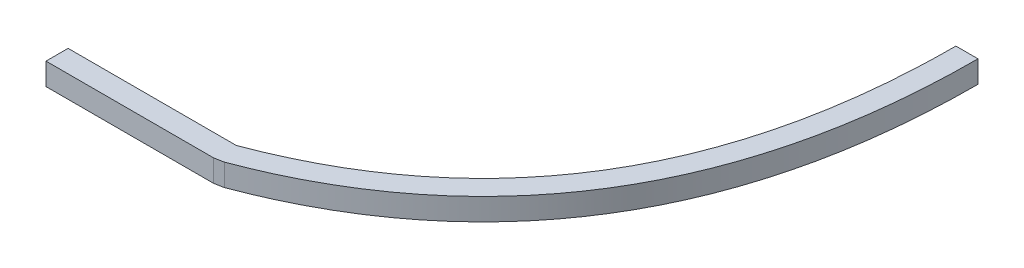
ISO-10303-21;
HEADER;
FILE_DESCRIPTION(('STEP AP214'),'2;1');
FILE_NAME('part.step','',(''),(''),'','','');
FILE_SCHEMA(('AUTOMOTIVE_DESIGN { 1 0 10303 214 1 1 1 1 }'));
ENDSEC;
DATA;
#1=APPLICATION_CONTEXT('core data for automotive mechanical design processes');
#2=APPLICATION_PROTOCOL_DEFINITION('international standard','automotive_design',2000,#1);
#3=PRODUCT_CONTEXT('',#1,'mechanical');
#4=PRODUCT('Part','Part','',(#3));
#5=PRODUCT_RELATED_PRODUCT_CATEGORY('part','',(#4));
#6=PRODUCT_DEFINITION_FORMATION('','',#4);
#7=PRODUCT_DEFINITION_CONTEXT('part definition',#1,'design');
#8=PRODUCT_DEFINITION('design','',#6,#7);
#9=PRODUCT_DEFINITION_SHAPE('','',#8);
#10=(LENGTH_UNIT() NAMED_UNIT(*) SI_UNIT(.MILLI.,.METRE.));
#11=(NAMED_UNIT(*) PLANE_ANGLE_UNIT() SI_UNIT($,.RADIAN.));
#12=(NAMED_UNIT(*) SI_UNIT($,.STERADIAN.) SOLID_ANGLE_UNIT());
#13=UNCERTAINTY_MEASURE_WITH_UNIT(LENGTH_MEASURE(1.E-05),#10,'distance_accuracy_value','');
#14=(GEOMETRIC_REPRESENTATION_CONTEXT(3) GLOBAL_UNCERTAINTY_ASSIGNED_CONTEXT((#13)) GLOBAL_UNIT_ASSIGNED_CONTEXT((#10,
#11,#12)) REPRESENTATION_CONTEXT('',''));
#15=CARTESIAN_POINT('',(0.,0.,0.));
#16=DIRECTION('',(0.,0.,1.));
#17=DIRECTION('',(1.,0.,0.));
#18=AXIS2_PLACEMENT_3D('',#15,#16,#17);
#19=CARTESIAN_POINT('',(-99.9999999999999,0.,0.));
#20=DIRECTION('',(1.,0.,0.));
#21=DIRECTION('',(0.,0.,-1.));
#22=AXIS2_PLACEMENT_3D('',#19,#20,#21);
#23=PLANE('',#22);
#24=DIRECTION('',(0.,0.,-1.));
#25=VECTOR('',#24,1.);
#26=CARTESIAN_POINT('',(-99.9999999999999,5.,0.));
#27=LINE('',#26,#25);
#28=CARTESIAN_POINT('',(-99.9999999999999,5.,5.));
#29=VERTEX_POINT('',#28);
#30=CARTESIAN_POINT('',(-99.9999999999999,5.,0.));
#31=VERTEX_POINT('',#30);
#32=EDGE_CURVE('E11',#29,#31,#27,.T.);
#33=ORIENTED_EDGE('',*,*,#32,.T.);
#34=DIRECTION('',(0.,1.,0.));
#35=VECTOR('',#34,1.);
#36=CARTESIAN_POINT('',(-99.9999999999999,5.,0.));
#37=LINE('',#36,#35);
#38=CARTESIAN_POINT('',(-99.9999999999999,0.,0.));
#39=VERTEX_POINT('',#38);
#40=EDGE_CURVE('E54',#39,#31,#37,.T.);
#41=ORIENTED_EDGE('',*,*,#40,.F.);
#42=DIRECTION('',(0.,0.,-1.));
#43=VECTOR('',#42,1.);
#44=CARTESIAN_POINT('',(-99.9999999999999,0.,0.));
#45=LINE('',#44,#43);
#46=CARTESIAN_POINT('',(-99.9999999999999,0.,5.));
#47=VERTEX_POINT('',#46);
#48=EDGE_CURVE('E108',#47,#39,#45,.T.);
#49=ORIENTED_EDGE('',*,*,#48,.F.);
#50=DIRECTION('',(0.,1.,0.));
#51=VECTOR('',#50,1.);
#52=CARTESIAN_POINT('',(-99.9999999999999,5.,5.));
#53=LINE('',#52,#51);
#54=EDGE_CURVE('E41',#47,#29,#53,.T.);
#55=ORIENTED_EDGE('',*,*,#54,.T.);
#56=EDGE_LOOP('',(#33,#41,#49,#55));
#57=FACE_BOUND('',#56,.T.);
#58=ADVANCED_FACE('F34',(#57),#23,.F.);
#59=CARTESIAN_POINT('',(-1.09929091052435,5.,-6.06425803318716));
#60=DIRECTION('',(0.178366872660046,0.,0.983964053579944));
#61=DIRECTION('',(0.983964053579944,0.,-0.178366872660046));
#62=AXIS2_PLACEMENT_3D('',#59,#60,#61);
#63=PLANE('',#62);
#64=DIRECTION('',(-0.983964053579944,0.,0.178366872660046));
#65=VECTOR('',#64,1.);
#66=CARTESIAN_POINT('',(-1.09929091052435,0.,-6.06425803318716));
#67=LINE('',#66,#65);
#68=CARTESIAN_POINT('',(-60.029389791564,0.,4.61822310493532));
#69=VERTEX_POINT('',#68);
#70=CARTESIAN_POINT('',(-62.1354688836552,0.,5.));
#71=VERTEX_POINT('',#70);
#72=EDGE_CURVE('E217',#69,#71,#67,.T.);
#73=ORIENTED_EDGE('',*,*,#72,.F.);
#74=DIRECTION('',(0.,-1.,0.));
#75=VECTOR('',#74,1.);
#76=CARTESIAN_POINT('',(-60.029389791564,5.,4.61822310493532));
#77=LINE('',#76,#75);
#78=CARTESIAN_POINT('',(-60.029389791564,5.,4.61822310493532));
#79=VERTEX_POINT('',#78);
#80=EDGE_CURVE('E109',#79,#69,#77,.T.);
#81=ORIENTED_EDGE('',*,*,#80,.F.);
#82=DIRECTION('',(-0.983964053579944,0.,0.178366872660046));
#83=VECTOR('',#82,1.);
#84=CARTESIAN_POINT('',(-1.09929091052435,5.,-6.06425803318716));
#85=LINE('',#84,#83);
#86=CARTESIAN_POINT('',(-62.1354688836552,5.,5.));
#87=VERTEX_POINT('',#86);
#88=EDGE_CURVE('E115',#79,#87,#85,.T.);
#89=ORIENTED_EDGE('',*,*,#88,.T.);
#90=DIRECTION('',(0.,-1.,0.));
#91=VECTOR('',#90,1.);
#92=CARTESIAN_POINT('',(-62.1354688836552,5.,5.));
#93=LINE('',#92,#91);
#94=EDGE_CURVE('E98',#87,#71,#93,.T.);
#95=ORIENTED_EDGE('',*,*,#94,.T.);
#96=EDGE_LOOP('',(#73,#81,#89,#95));
#97=FACE_BOUND('',#96,.T.);
#98=ADVANCED_FACE('F120',(#97),#63,.T.);
#99=CARTESIAN_POINT('',(4.99999999947875,5.,-100.895849916795));
#100=CARTESIAN_POINT('',(4.99997726524365,5.,-99.2529572050394));
#101=CARTESIAN_POINT('',(4.95867961132379,5.,-95.9431932944503));
#102=CARTESIAN_POINT('',(4.71050968729381,5.,-89.5186149229666));
#103=CARTESIAN_POINT('',(4.0887112395192,5.,-81.7192099936615));
#104=CARTESIAN_POINT('',(2.83992376022696,5.,-72.7719958036434));
#105=CARTESIAN_POINT('',(0.498709277099774,5.,-61.3784422074442));
#106=CARTESIAN_POINT('',(-3.70763238244548,5.,-48.1536983343341));
#107=CARTESIAN_POINT('',(-10.8355275259043,5.,-33.9502685151708));
#108=CARTESIAN_POINT('',(-20.0503219588501,5.,-21.4829336793479));
#109=CARTESIAN_POINT('',(-29.4374140417272,5.00000000000036,-12.6021265103812));
#110=CARTESIAN_POINT('',(-37.9382918211954,5.00000000000036,-6.42423847160051));
#111=CARTESIAN_POINT('',(-44.7987468654031,5.00000000000036,-2.25574861979044));
#112=CARTESIAN_POINT('',(-50.9191031389923,5.00000000000036,0.833403375961328));
#113=CARTESIAN_POINT('',(-56.040793539037,5.00000000000036,3.07035598008887));
#114=CARTESIAN_POINT('',(-58.6991091566506,5.,4.11954653416319));
#115=CARTESIAN_POINT('',(-60.029389791564,5.,4.61822310493532));
#116=B_SPLINE_CURVE_WITH_KNOTS('',3,(#99,#100,#101,#102,#103,#104,#105,#106,#107,#108,#109,#110,
#111,#112,#113,#114,#115),.UNSPECIFIED.,.F.,.F.,(4,1,1,1,1,1,1,1,1,1,1,1,1,1,4),
(0.497169381797137,0.497311210500095,0.497453039203052,0.497736696608966,0.498020354014881,
0.498304011420796,0.498871326232625,0.499438641044454,0.500005955856283,0.500573270668112,
0.500856928074027,0.501140585479941,0.501424242885856,0.501566071588813,0.50170790029177),.UNSPECIFIED.);
#117=DIRECTION('',(0.,-1.,0.));
#118=VECTOR('',#117,1.);
#119=SURFACE_OF_LINEAR_EXTRUSION('',#116,#118);
#120=CARTESIAN_POINT('',(4.99999999947875,0.,-100.895849916795));
#121=CARTESIAN_POINT('',(4.99997726524365,0.,-99.2529572050394));
#122=CARTESIAN_POINT('',(4.95867961132379,0.,-95.9431932944503));
#123=CARTESIAN_POINT('',(4.71050968729381,0.,-89.5186149229666));
#124=CARTESIAN_POINT('',(4.0887112395192,0.,-81.7192099936615));
#125=CARTESIAN_POINT('',(2.83992376022696,0.,-72.7719958036434));
#126=CARTESIAN_POINT('',(0.498709277099774,0.,-61.3784422074442));
#127=CARTESIAN_POINT('',(-3.70763238244548,0.,-48.1536983343341));
#128=CARTESIAN_POINT('',(-10.8355275259043,0.,-33.9502685151708));
#129=CARTESIAN_POINT('',(-20.0503219588501,0.,-21.4829336793479));
#130=CARTESIAN_POINT('',(-29.4374140417272,3.60822483003176E-13,-12.6021265103812));
#131=CARTESIAN_POINT('',(-37.9382918211954,3.60822483003176E-13,-6.42423847160051));
#132=CARTESIAN_POINT('',(-44.7987468654031,3.60822483003176E-13,-2.25574861979044));
#133=CARTESIAN_POINT('',(-50.9191031389923,3.60822483003176E-13,0.833403375961328));
#134=CARTESIAN_POINT('',(-56.040793539037,3.60822483003176E-13,3.07035598008887));
#135=CARTESIAN_POINT('',(-58.6991091566506,0.,4.11954653416319));
#136=CARTESIAN_POINT('',(-60.029389791564,0.,4.61822310493532));
#137=B_SPLINE_CURVE_WITH_KNOTS('',3,(#120,#121,#122,#123,#124,#125,#126,#127,#128,#129,#130,
#131,#132,#133,#134,#135,#136),.UNSPECIFIED.,.F.,.F.,(4,1,1,1,1,1,1,1,1,1,1,1,1,1,4),
(0.497169381797137,0.497311210500095,0.497453039203052,0.497736696608966,0.498020354014881,
0.498304011420796,0.498871326232625,0.499438641044454,0.500005955856283,0.500573270668112,
0.500856928074027,0.501140585479941,0.501424242885856,0.501566071588813,0.50170790029177),.UNSPECIFIED.);
#138=CARTESIAN_POINT('',(4.99999999947875,0.,-100.895849916795));
#139=VERTEX_POINT('',#138);
#140=EDGE_CURVE('E219',#139,#69,#137,.T.);
#141=ORIENTED_EDGE('',*,*,#140,.F.);
#142=DIRECTION('',(0.,-1.,0.));
#143=VECTOR('',#142,1.);
#144=CARTESIAN_POINT('',(4.99999999947875,5.,-100.895849916795));
#145=LINE('',#144,#143);
#146=CARTESIAN_POINT('',(4.99999999947875,5.,-100.895849916795));
#147=VERTEX_POINT('',#146);
#148=EDGE_CURVE('E287',#147,#139,#145,.T.);
#149=ORIENTED_EDGE('',*,*,#148,.F.);
#150=EDGE_CURVE('E121',#147,#79,#116,.T.);
#151=ORIENTED_EDGE('',*,*,#150,.T.);
#152=ORIENTED_EDGE('',*,*,#80,.T.);
#153=EDGE_LOOP('',(#141,#149,#151,#152));
#154=FACE_BOUND('',#153,.T.);
#155=ADVANCED_FACE('F135',(#154),#119,.T.);
#156=CARTESIAN_POINT('',(0.0013961907129878,5.,-100.895919087127));
#157=DIRECTION('',(-1.38379304681635E-05,0.,0.999999999904256));
#158=DIRECTION('',(0.999999999904256,0.,1.38379304681635E-05));
#159=AXIS2_PLACEMENT_3D('',#156,#157,#158);
#160=PLANE('',#159);
#161=DIRECTION('',(-0.999999999904256,0.,-1.38379304681635E-05));
#162=VECTOR('',#161,1.);
#163=CARTESIAN_POINT('',(0.0013961907129878,0.,-100.895919087127));
#164=LINE('',#163,#162);
#165=CARTESIAN_POINT('',(-4.25215418431435E-11,0.,-100.895919106447));
#166=VERTEX_POINT('',#165);
#167=EDGE_CURVE('E224',#139,#166,#164,.T.);
#168=ORIENTED_EDGE('',*,*,#167,.T.);
#169=CARTESIAN_POINT('',(-3.70500545933232E-11,5.,-100.89591910644));
#170=DIRECTION('',(0.,-1.,0.));
#171=VECTOR('',#170,1.);
#172=LINE('',#169,#171);
#173=CARTESIAN_POINT('',(-4.25215418431435E-11,5.,-100.895919106447));
#174=VERTEX_POINT('',#173);
#175=EDGE_CURVE('E194',#174,#166,#172,.T.);
#176=ORIENTED_EDGE('',*,*,#175,.F.);
#177=DIRECTION('',(-0.999999999904256,0.,-1.38379304681635E-05));
#178=VECTOR('',#177,1.);
#179=CARTESIAN_POINT('',(0.0013961907129878,5.,-100.895919087127));
#180=LINE('',#179,#178);
#181=EDGE_CURVE('E123',#147,#174,#180,.T.);
#182=ORIENTED_EDGE('',*,*,#181,.F.);
#183=ORIENTED_EDGE('',*,*,#148,.T.);
#184=EDGE_LOOP('',(#168,#176,#182,#183));
#185=FACE_BOUND('',#184,.T.);
#186=ADVANCED_FACE('F139',(#185),#160,.F.);
#187=CARTESIAN_POINT('',(-3.70500545933232E-11,5.,-100.89591910644));
#188=CARTESIAN_POINT('',(-0.00107481728775504,5.,-23.2240993123991));
#189=CARTESIAN_POINT('',(-61.7844557016589,5.,-0.0636294825604455));
#190=B_SPLINE_CURVE_WITH_KNOTS('',2,(#187,#188,#189),.UNSPECIFIED.,.F.,.F.,(3,3),(0.,1.),.UNSPECIFIED.);
#191=DIRECTION('',(0.,-1.,0.));
#192=VECTOR('',#191,1.);
#193=SURFACE_OF_LINEAR_EXTRUSION('',#190,#192);
#194=CARTESIAN_POINT('',(-3.70500545933232E-11,0.,-100.89591910644));
#195=CARTESIAN_POINT('',(-0.00107481728775504,0.,-23.2240993123991));
#196=CARTESIAN_POINT('',(-61.7844557016589,0.,-0.0636294825604455));
#197=B_SPLINE_CURVE_WITH_KNOTS('',2,(#194,#195,#196),.UNSPECIFIED.,.F.,.F.,(3,3),(0.,1.),.UNSPECIFIED.);
#198=CARTESIAN_POINT('',(-61.7844557016353,0.,-0.0636294824973849));
#199=VERTEX_POINT('',#198);
#200=EDGE_CURVE('E189',#166,#199,#197,.T.);
#201=ORIENTED_EDGE('',*,*,#200,.T.);
#202=CARTESIAN_POINT('',(-61.7844557016589,0.,-0.0636294825604455));
#203=DIRECTION('',(0.,1.,0.));
#204=VECTOR('',#203,1.);
#205=LINE('',#202,#204);
#206=CARTESIAN_POINT('',(-61.7844557016353,5.,-0.0636294824973849));
#207=VERTEX_POINT('',#206);
#208=EDGE_CURVE('E185',#207,#199,#205,.F.);
#209=ORIENTED_EDGE('',*,*,#208,.F.);
#210=CARTESIAN_POINT('',(-61.7844557016589,5.,-0.0636294825604455));
#211=CARTESIAN_POINT('',(-0.00107481728775504,5.,-23.2240993123991));
#212=CARTESIAN_POINT('',(-3.70500545933232E-11,5.,-100.89591910644));
#213=B_SPLINE_CURVE_WITH_KNOTS('',2,(#210,#211,#212),.UNSPECIFIED.,.F.,.F.,(3,3),(0.,1.),.UNSPECIFIED.);
#214=EDGE_CURVE('E174',#174,#207,#213,.F.);
#215=ORIENTED_EDGE('',*,*,#214,.F.);
#216=ORIENTED_EDGE('',*,*,#175,.T.);
#217=EDGE_LOOP('',(#201,#209,#215,#216));
#218=FACE_BOUND('',#217,.T.);
#219=ADVANCED_FACE('F187',(#218),#193,.F.);
#220=CARTESIAN_POINT('',(-1.97682386490189,5.,-10.9051843245876));
#221=DIRECTION('',(0.17836687262137,0.,0.983964053586955));
#222=DIRECTION('',(0.983964053586955,0.,-0.17836687262137));
#223=AXIS2_PLACEMENT_3D('',#220,#221,#222);
#224=PLANE('',#223);
#225=DIRECTION('',(-0.983964053586955,0.,0.17836687262137));
#226=VECTOR('',#225,1.);
#227=CARTESIAN_POINT('',(-1.97682386490189,0.,-10.9051843245876));
#228=LINE('',#227,#226);
#229=CARTESIAN_POINT('',(-62.1354688836552,0.,0.));
#230=VERTEX_POINT('',#229);
#231=EDGE_CURVE('E231',#199,#230,#228,.T.);
#232=ORIENTED_EDGE('',*,*,#231,.T.);
#233=DIRECTION('',(0.,-1.,0.));
#234=VECTOR('',#233,1.);
#235=CARTESIAN_POINT('',(-62.1354688836552,5.,0.));
#236=LINE('',#235,#234);
#237=CARTESIAN_POINT('',(-62.1354688836552,5.,0.));
#238=VERTEX_POINT('',#237);
#239=EDGE_CURVE('E195',#238,#230,#236,.T.);
#240=ORIENTED_EDGE('',*,*,#239,.F.);
#241=DIRECTION('',(-0.983964053586955,0.,0.17836687262137));
#242=VECTOR('',#241,1.);
#243=CARTESIAN_POINT('',(-1.97682386490189,5.,-10.9051843245876));
#244=LINE('',#243,#242);
#245=EDGE_CURVE('E177',#207,#238,#244,.T.);
#246=ORIENTED_EDGE('',*,*,#245,.F.);
#247=ORIENTED_EDGE('',*,*,#208,.T.);
#248=EDGE_LOOP('',(#232,#240,#246,#247));
#249=FACE_BOUND('',#248,.T.);
#250=ADVANCED_FACE('F153',(#249),#224,.F.);
#251=CARTESIAN_POINT('',(0.,5.,0.));
#252=DIRECTION('',(0.,0.,1.));
#253=DIRECTION('',(1.,0.,0.));
#254=AXIS2_PLACEMENT_3D('',#251,#252,#253);
#255=PLANE('',#254);
#256=DIRECTION('',(-1.,0.,0.));
#257=VECTOR('',#256,1.);
#258=CARTESIAN_POINT('',(0.,0.,0.));
#259=LINE('',#258,#257);
#260=EDGE_CURVE('E118',#230,#39,#259,.T.);
#261=ORIENTED_EDGE('',*,*,#260,.T.);
#262=ORIENTED_EDGE('',*,*,#40,.T.);
#263=DIRECTION('',(-1.,0.,0.));
#264=VECTOR('',#263,1.);
#265=CARTESIAN_POINT('',(0.,5.,0.));
#266=LINE('',#265,#264);
#267=EDGE_CURVE('E199',#238,#31,#266,.T.);
#268=ORIENTED_EDGE('',*,*,#267,.F.);
#269=ORIENTED_EDGE('',*,*,#239,.T.);
#270=EDGE_LOOP('',(#261,#262,#268,#269));
#271=FACE_BOUND('',#270,.T.);
#272=ADVANCED_FACE('F146',(#271),#255,.F.);
#273=CARTESIAN_POINT('',(0.,5.,5.));
#274=DIRECTION('',(0.,0.,1.));
#275=DIRECTION('',(1.,0.,0.));
#276=AXIS2_PLACEMENT_3D('',#273,#274,#275);
#277=PLANE('',#276);
#278=ORIENTED_EDGE('',*,*,#54,.F.);
#279=DIRECTION('',(-1.,0.,0.));
#280=VECTOR('',#279,1.);
#281=CARTESIAN_POINT('',(0.,0.,5.));
#282=LINE('',#281,#280);
#283=EDGE_CURVE('E103',#71,#47,#282,.T.);
#284=ORIENTED_EDGE('',*,*,#283,.F.);
#285=ORIENTED_EDGE('',*,*,#94,.F.);
#286=DIRECTION('',(-1.,0.,0.));
#287=VECTOR('',#286,1.);
#288=CARTESIAN_POINT('',(0.,5.,5.));
#289=LINE('',#288,#287);
#290=EDGE_CURVE('E101',#87,#29,#289,.T.);
#291=ORIENTED_EDGE('',*,*,#290,.T.);
#292=EDGE_LOOP('',(#278,#284,#285,#291));
#293=FACE_BOUND('',#292,.T.);
#294=ADVANCED_FACE('F100',(#293),#277,.T.);
#295=CARTESIAN_POINT('',(0.,0.,0.));
#296=DIRECTION('',(0.,1.,0.));
#297=DIRECTION('',(0.,0.,1.));
#298=AXIS2_PLACEMENT_3D('',#295,#296,#297);
#299=PLANE('',#298);
#300=ORIENTED_EDGE('',*,*,#283,.T.);
#301=ORIENTED_EDGE('',*,*,#48,.T.);
#302=ORIENTED_EDGE('',*,*,#260,.F.);
#303=ORIENTED_EDGE('',*,*,#231,.F.);
#304=ORIENTED_EDGE('',*,*,#200,.F.);
#305=ORIENTED_EDGE('',*,*,#167,.F.);
#306=ORIENTED_EDGE('',*,*,#140,.T.);
#307=ORIENTED_EDGE('',*,*,#72,.T.);
#308=EDGE_LOOP('',(#300,#301,#302,#303,#304,#305,#306,#307));
#309=FACE_BOUND('',#308,.T.);
#310=ADVANCED_FACE('F145',(#309),#299,.F.);
#311=CARTESIAN_POINT('',(0.,5.,0.));
#312=DIRECTION('',(0.,1.,0.));
#313=DIRECTION('',(0.,0.,1.));
#314=AXIS2_PLACEMENT_3D('',#311,#312,#313);
#315=PLANE('',#314);
#316=ORIENTED_EDGE('',*,*,#32,.F.);
#317=ORIENTED_EDGE('',*,*,#290,.F.);
#318=ORIENTED_EDGE('',*,*,#88,.F.);
#319=ORIENTED_EDGE('',*,*,#150,.F.);
#320=ORIENTED_EDGE('',*,*,#181,.T.);
#321=ORIENTED_EDGE('',*,*,#214,.T.);
#322=ORIENTED_EDGE('',*,*,#245,.T.);
#323=ORIENTED_EDGE('',*,*,#267,.T.);
#324=EDGE_LOOP('',(#316,#317,#318,#319,#320,#321,#322,#323));
#325=FACE_BOUND('',#324,.T.);
#326=ADVANCED_FACE('F113',(#325),#315,.T.);
#327=CLOSED_SHELL('',(#58,#98,#155,#186,#219,#250,#272,#294,#310,#326));
#328=MANIFOLD_SOLID_BREP('B2',#327);
#329=ADVANCED_BREP_SHAPE_REPRESENTATION('',(#18,#328),#14);
#330=SHAPE_DEFINITION_REPRESENTATION(#9,#329);
ENDSEC;
END-ISO-10303-21;
